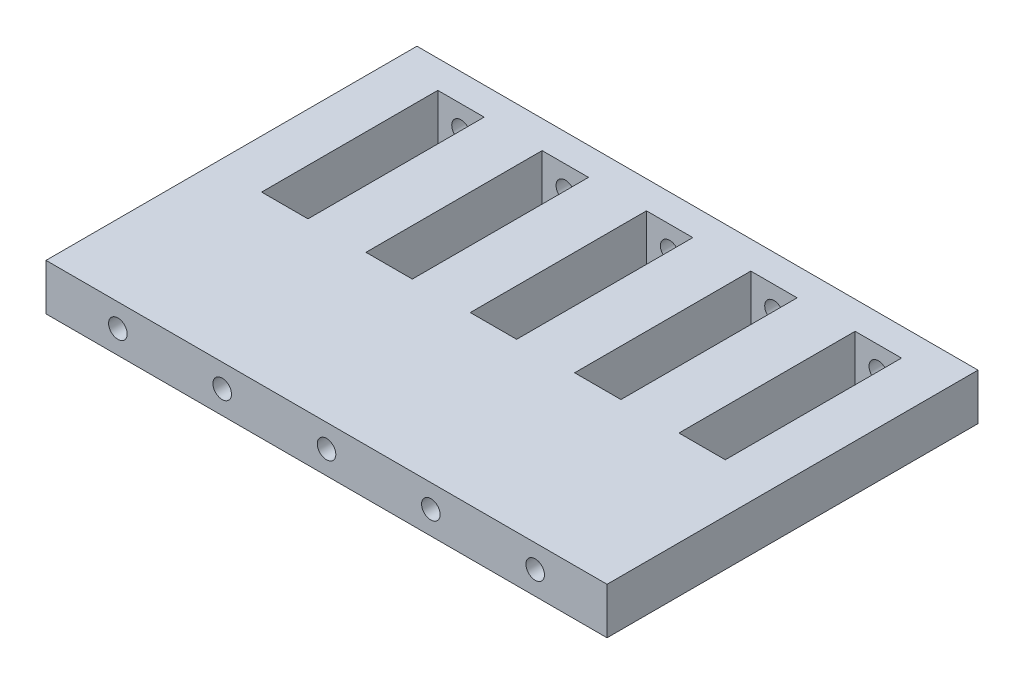
ISO-10303-21;
HEADER;
FILE_DESCRIPTION(('STEP AP214'),'2;1');
FILE_NAME('part.step','',(''),(''),'','','');
FILE_SCHEMA(('AUTOMOTIVE_DESIGN { 1 0 10303 214 1 1 1 1 }'));
ENDSEC;
DATA;
#1=APPLICATION_CONTEXT('core data for automotive mechanical design processes');
#2=APPLICATION_PROTOCOL_DEFINITION('international standard','automotive_design',2000,#1);
#3=PRODUCT_CONTEXT('',#1,'mechanical');
#4=PRODUCT('Part','Part','',(#3));
#5=PRODUCT_RELATED_PRODUCT_CATEGORY('part','',(#4));
#6=PRODUCT_DEFINITION_FORMATION('','',#4);
#7=PRODUCT_DEFINITION_CONTEXT('part definition',#1,'design');
#8=PRODUCT_DEFINITION('design','',#6,#7);
#9=PRODUCT_DEFINITION_SHAPE('','',#8);
#10=(LENGTH_UNIT() NAMED_UNIT(*) SI_UNIT(.MILLI.,.METRE.));
#11=(NAMED_UNIT(*) PLANE_ANGLE_UNIT() SI_UNIT($,.RADIAN.));
#12=(NAMED_UNIT(*) SI_UNIT($,.STERADIAN.) SOLID_ANGLE_UNIT());
#13=UNCERTAINTY_MEASURE_WITH_UNIT(LENGTH_MEASURE(1.E-05),#10,'distance_accuracy_value','');
#14=(GEOMETRIC_REPRESENTATION_CONTEXT(3) GLOBAL_UNCERTAINTY_ASSIGNED_CONTEXT((#13)) GLOBAL_UNIT_ASSIGNED_CONTEXT((#10,
#11,#12)) REPRESENTATION_CONTEXT('',''));
#15=CARTESIAN_POINT('',(0.,0.,0.));
#16=DIRECTION('',(0.,0.,1.));
#17=DIRECTION('',(1.,0.,0.));
#18=AXIS2_PLACEMENT_3D('',#15,#16,#17);
#19=CARTESIAN_POINT('',(-50.5,10.,0.));
#20=DIRECTION('',(1.,0.,0.));
#21=DIRECTION('',(0.,0.,-1.));
#22=AXIS2_PLACEMENT_3D('',#19,#20,#21);
#23=PLANE('',#22);
#24=DIRECTION('',(0.,0.,1.));
#25=VECTOR('',#24,1.);
#26=CARTESIAN_POINT('',(-50.5,0.,0.));
#27=LINE('',#26,#25);
#28=CARTESIAN_POINT('',(-50.5,0.,-80.));
#29=VERTEX_POINT('',#28);
#30=CARTESIAN_POINT('',(-50.5,0.,0.));
#31=VERTEX_POINT('',#30);
#32=EDGE_CURVE('E343',#29,#31,#27,.T.);
#33=ORIENTED_EDGE('',*,*,#32,.T.);
#34=DIRECTION('',(0.,-1.,0.));
#35=VECTOR('',#34,1.);
#36=CARTESIAN_POINT('',(-50.5,10.,0.));
#37=LINE('',#36,#35);
#38=CARTESIAN_POINT('',(-50.5,10.,0.));
#39=VERTEX_POINT('',#38);
#40=EDGE_CURVE('E11',#39,#31,#37,.T.);
#41=ORIENTED_EDGE('',*,*,#40,.F.);
#42=DIRECTION('',(0.,0.,1.));
#43=VECTOR('',#42,1.);
#44=CARTESIAN_POINT('',(-50.5,10.,0.));
#45=LINE('',#44,#43);
#46=CARTESIAN_POINT('',(-50.5,10.,-80.));
#47=VERTEX_POINT('',#46);
#48=EDGE_CURVE('E412',#47,#39,#45,.T.);
#49=ORIENTED_EDGE('',*,*,#48,.F.);
#50=DIRECTION('',(0.,-1.,0.));
#51=VECTOR('',#50,1.);
#52=CARTESIAN_POINT('',(-50.5,10.,-80.));
#53=LINE('',#52,#51);
#54=EDGE_CURVE('E422',#47,#29,#53,.T.);
#55=ORIENTED_EDGE('',*,*,#54,.T.);
#56=EDGE_LOOP('',(#33,#41,#49,#55));
#57=FACE_BOUND('',#56,.T.);
#58=ADVANCED_FACE('F37',(#57),#23,.F.);
#59=CARTESIAN_POINT('',(-50.5,10.,0.));
#60=DIRECTION('',(0.,0.,-1.));
#61=DIRECTION('',(-1.,0.,0.));
#62=AXIS2_PLACEMENT_3D('',#59,#60,#61);
#63=PLANE('',#62);
#64=CARTESIAN_POINT('',(-35.,5.,0.));
#65=DIRECTION('',(0.,0.,1.));
#66=DIRECTION('',(1.,0.,0.));
#67=AXIS2_PLACEMENT_3D('',#64,#65,#66);
#68=CIRCLE('',#67,2.);
#69=CARTESIAN_POINT('',(-33.,5.,0.));
#70=VERTEX_POINT('',#69);
#71=EDGE_CURVE('E279',#70,#70,#68,.T.);
#72=ORIENTED_EDGE('',*,*,#71,.F.);
#73=EDGE_LOOP('',(#72));
#74=FACE_BOUND('',#73,.T.);
#75=CARTESIAN_POINT('',(-12.5,5.,0.));
#76=DIRECTION('',(0.,0.,1.));
#77=DIRECTION('',(1.,0.,0.));
#78=AXIS2_PLACEMENT_3D('',#75,#76,#77);
#79=CIRCLE('',#78,2.);
#80=CARTESIAN_POINT('',(-10.5,5.,0.));
#81=VERTEX_POINT('',#80);
#82=EDGE_CURVE('E282',#81,#81,#79,.T.);
#83=ORIENTED_EDGE('',*,*,#82,.F.);
#84=EDGE_LOOP('',(#83));
#85=FACE_BOUND('',#84,.T.);
#86=CARTESIAN_POINT('',(9.99999999999999,5.,0.));
#87=DIRECTION('',(0.,0.,1.));
#88=DIRECTION('',(1.,0.,0.));
#89=AXIS2_PLACEMENT_3D('',#86,#87,#88);
#90=CIRCLE('',#89,2.);
#91=CARTESIAN_POINT('',(12.,5.,0.));
#92=VERTEX_POINT('',#91);
#93=EDGE_CURVE('E288',#92,#92,#90,.T.);
#94=ORIENTED_EDGE('',*,*,#93,.F.);
#95=EDGE_LOOP('',(#94));
#96=FACE_BOUND('',#95,.T.);
#97=CARTESIAN_POINT('',(32.5,5.,0.));
#98=DIRECTION('',(0.,0.,1.));
#99=DIRECTION('',(1.,0.,0.));
#100=AXIS2_PLACEMENT_3D('',#97,#98,#99);
#101=CIRCLE('',#100,2.);
#102=CARTESIAN_POINT('',(34.5,5.,0.));
#103=VERTEX_POINT('',#102);
#104=EDGE_CURVE('E294',#103,#103,#101,.T.);
#105=ORIENTED_EDGE('',*,*,#104,.F.);
#106=EDGE_LOOP('',(#105));
#107=FACE_BOUND('',#106,.T.);
#108=CARTESIAN_POINT('',(55.,5.,0.));
#109=DIRECTION('',(0.,0.,1.));
#110=DIRECTION('',(1.,0.,0.));
#111=AXIS2_PLACEMENT_3D('',#108,#109,#110);
#112=CIRCLE('',#111,2.);
#113=CARTESIAN_POINT('',(57.,5.,0.));
#114=VERTEX_POINT('',#113);
#115=EDGE_CURVE('E300',#114,#114,#112,.T.);
#116=ORIENTED_EDGE('',*,*,#115,.F.);
#117=EDGE_LOOP('',(#116));
#118=FACE_BOUND('',#117,.T.);
#119=DIRECTION('',(1.,0.,0.));
#120=VECTOR('',#119,1.);
#121=CARTESIAN_POINT('',(-50.5,0.,0.));
#122=LINE('',#121,#120);
#123=CARTESIAN_POINT('',(70.5,0.,0.));
#124=VERTEX_POINT('',#123);
#125=EDGE_CURVE('E425',#31,#124,#122,.T.);
#126=ORIENTED_EDGE('',*,*,#125,.T.);
#127=DIRECTION('',(0.,-1.,0.));
#128=VECTOR('',#127,1.);
#129=CARTESIAN_POINT('',(70.5,10.,0.));
#130=LINE('',#129,#128);
#131=CARTESIAN_POINT('',(70.5,10.,0.));
#132=VERTEX_POINT('',#131);
#133=EDGE_CURVE('E45',#132,#124,#130,.T.);
#134=ORIENTED_EDGE('',*,*,#133,.F.);
#135=DIRECTION('',(1.,0.,0.));
#136=VECTOR('',#135,1.);
#137=CARTESIAN_POINT('',(-50.5,10.,0.));
#138=LINE('',#137,#136);
#139=EDGE_CURVE('E415',#39,#132,#138,.T.);
#140=ORIENTED_EDGE('',*,*,#139,.F.);
#141=ORIENTED_EDGE('',*,*,#40,.T.);
#142=EDGE_LOOP('',(#126,#134,#140,#141));
#143=FACE_BOUND('',#142,.T.);
#144=ADVANCED_FACE('F466',(#74,#85,#96,#107,#118,#143),#63,.F.);
#145=CARTESIAN_POINT('',(70.5,10.,0.));
#146=DIRECTION('',(-1.,0.,0.));
#147=DIRECTION('',(0.,0.,1.));
#148=AXIS2_PLACEMENT_3D('',#145,#146,#147);
#149=PLANE('',#148);
#150=DIRECTION('',(0.,0.,-1.));
#151=VECTOR('',#150,1.);
#152=CARTESIAN_POINT('',(70.5,0.,0.));
#153=LINE('',#152,#151);
#154=CARTESIAN_POINT('',(70.5,0.,-80.));
#155=VERTEX_POINT('',#154);
#156=EDGE_CURVE('E427',#124,#155,#153,.T.);
#157=ORIENTED_EDGE('',*,*,#156,.T.);
#158=DIRECTION('',(0.,-1.,0.));
#159=VECTOR('',#158,1.);
#160=CARTESIAN_POINT('',(70.5,10.,-80.));
#161=LINE('',#160,#159);
#162=CARTESIAN_POINT('',(70.5,10.,-80.));
#163=VERTEX_POINT('',#162);
#164=EDGE_CURVE('E432',#163,#155,#161,.T.);
#165=ORIENTED_EDGE('',*,*,#164,.F.);
#166=DIRECTION('',(0.,0.,-1.));
#167=VECTOR('',#166,1.);
#168=CARTESIAN_POINT('',(70.5,10.,0.));
#169=LINE('',#168,#167);
#170=EDGE_CURVE('E418',#132,#163,#169,.T.);
#171=ORIENTED_EDGE('',*,*,#170,.F.);
#172=ORIENTED_EDGE('',*,*,#133,.T.);
#173=EDGE_LOOP('',(#157,#165,#171,#172));
#174=FACE_BOUND('',#173,.T.);
#175=ADVANCED_FACE('F471',(#174),#149,.F.);
#176=CARTESIAN_POINT('',(-50.5,10.,-80.));
#177=DIRECTION('',(0.,0.,1.));
#178=DIRECTION('',(1.,0.,0.));
#179=AXIS2_PLACEMENT_3D('',#176,#177,#178);
#180=PLANE('',#179);
#181=CARTESIAN_POINT('',(-35.,5.,-80.));
#182=DIRECTION('',(0.,0.,1.));
#183=DIRECTION('',(1.,0.,0.));
#184=AXIS2_PLACEMENT_3D('',#181,#182,#183);
#185=CIRCLE('',#184,2.);
#186=CARTESIAN_POINT('',(-33.,5.,-80.));
#187=VERTEX_POINT('',#186);
#188=EDGE_CURVE('E275',#187,#187,#185,.T.);
#189=ORIENTED_EDGE('',*,*,#188,.T.);
#190=EDGE_LOOP('',(#189));
#191=FACE_BOUND('',#190,.T.);
#192=CARTESIAN_POINT('',(-12.5,5.,-80.));
#193=DIRECTION('',(0.,0.,1.));
#194=DIRECTION('',(1.,0.,0.));
#195=AXIS2_PLACEMENT_3D('',#192,#193,#194);
#196=CIRCLE('',#195,2.);
#197=CARTESIAN_POINT('',(-10.5,5.,-80.));
#198=VERTEX_POINT('',#197);
#199=EDGE_CURVE('E285',#198,#198,#196,.T.);
#200=ORIENTED_EDGE('',*,*,#199,.T.);
#201=EDGE_LOOP('',(#200));
#202=FACE_BOUND('',#201,.T.);
#203=CARTESIAN_POINT('',(9.99999999999999,5.,-80.));
#204=DIRECTION('',(0.,0.,1.));
#205=DIRECTION('',(1.,0.,0.));
#206=AXIS2_PLACEMENT_3D('',#203,#204,#205);
#207=CIRCLE('',#206,2.);
#208=CARTESIAN_POINT('',(12.,5.,-80.));
#209=VERTEX_POINT('',#208);
#210=EDGE_CURVE('E291',#209,#209,#207,.T.);
#211=ORIENTED_EDGE('',*,*,#210,.T.);
#212=EDGE_LOOP('',(#211));
#213=FACE_BOUND('',#212,.T.);
#214=CARTESIAN_POINT('',(32.5,5.,-80.));
#215=DIRECTION('',(0.,0.,1.));
#216=DIRECTION('',(1.,0.,0.));
#217=AXIS2_PLACEMENT_3D('',#214,#215,#216);
#218=CIRCLE('',#217,2.);
#219=CARTESIAN_POINT('',(34.5,5.,-80.));
#220=VERTEX_POINT('',#219);
#221=EDGE_CURVE('E297',#220,#220,#218,.T.);
#222=ORIENTED_EDGE('',*,*,#221,.T.);
#223=EDGE_LOOP('',(#222));
#224=FACE_BOUND('',#223,.T.);
#225=CARTESIAN_POINT('',(55.,5.,-80.));
#226=DIRECTION('',(0.,0.,1.));
#227=DIRECTION('',(1.,0.,0.));
#228=AXIS2_PLACEMENT_3D('',#225,#226,#227);
#229=CIRCLE('',#228,2.);
#230=CARTESIAN_POINT('',(57.,5.,-80.));
#231=VERTEX_POINT('',#230);
#232=EDGE_CURVE('E274',#231,#231,#229,.T.);
#233=ORIENTED_EDGE('',*,*,#232,.T.);
#234=EDGE_LOOP('',(#233));
#235=FACE_BOUND('',#234,.T.);
#236=DIRECTION('',(-1.,0.,0.));
#237=VECTOR('',#236,1.);
#238=CARTESIAN_POINT('',(-50.5,0.,-80.));
#239=LINE('',#238,#237);
#240=EDGE_CURVE('E416',#155,#29,#239,.T.);
#241=ORIENTED_EDGE('',*,*,#240,.T.);
#242=ORIENTED_EDGE('',*,*,#54,.F.);
#243=DIRECTION('',(-1.,0.,0.));
#244=VECTOR('',#243,1.);
#245=CARTESIAN_POINT('',(-50.5,10.,-80.));
#246=LINE('',#245,#244);
#247=EDGE_CURVE('E420',#163,#47,#246,.T.);
#248=ORIENTED_EDGE('',*,*,#247,.F.);
#249=ORIENTED_EDGE('',*,*,#164,.T.);
#250=EDGE_LOOP('',(#241,#242,#248,#249));
#251=FACE_BOUND('',#250,.T.);
#252=ADVANCED_FACE('F488',(#191,#202,#213,#224,#235,#251),#180,.F.);
#253=CARTESIAN_POINT('',(0.,10.,0.));
#254=DIRECTION('',(0.,-1.,0.));
#255=DIRECTION('',(0.,0.,-1.));
#256=AXIS2_PLACEMENT_3D('',#253,#254,#255);
#257=PLANE('',#256);
#258=DIRECTION('',(-1.,0.,0.));
#259=VECTOR('',#258,1.);
#260=CARTESIAN_POINT('',(-40.,10.,-36.));
#261=LINE('',#260,#259);
#262=CARTESIAN_POINT('',(-7.49999999999999,10.,-36.));
#263=VERTEX_POINT('',#262);
#264=CARTESIAN_POINT('',(-17.5,10.,-36.));
#265=VERTEX_POINT('',#264);
#266=EDGE_CURVE('E233',#263,#265,#261,.T.);
#267=ORIENTED_EDGE('',*,*,#266,.T.);
#268=DIRECTION('',(0.,0.,1.));
#269=VECTOR('',#268,1.);
#270=CARTESIAN_POINT('',(-17.5,10.,-74.));
#271=LINE('',#270,#269);
#272=CARTESIAN_POINT('',(-17.5,10.,-74.));
#273=VERTEX_POINT('',#272);
#274=EDGE_CURVE('E352',#273,#265,#271,.T.);
#275=ORIENTED_EDGE('',*,*,#274,.F.);
#276=DIRECTION('',(-1.,0.,0.));
#277=VECTOR('',#276,1.);
#278=CARTESIAN_POINT('',(-17.5,10.,-74.));
#279=LINE('',#278,#277);
#280=CARTESIAN_POINT('',(-7.5,10.,-74.));
#281=VERTEX_POINT('',#280);
#282=EDGE_CURVE('E354',#281,#273,#279,.T.);
#283=ORIENTED_EDGE('',*,*,#282,.F.);
#284=DIRECTION('',(0.,0.,-1.));
#285=VECTOR('',#284,1.);
#286=CARTESIAN_POINT('',(-7.5,10.,-74.));
#287=LINE('',#286,#285);
#288=EDGE_CURVE('E337',#263,#281,#287,.T.);
#289=ORIENTED_EDGE('',*,*,#288,.F.);
#290=EDGE_LOOP('',(#267,#275,#283,#289));
#291=FACE_BOUND('',#290,.T.);
#292=CARTESIAN_POINT('',(15.,10.,-36.));
#293=VERTEX_POINT('',#292);
#294=CARTESIAN_POINT('',(5.,10.,-36.));
#295=VERTEX_POINT('',#294);
#296=EDGE_CURVE('E230',#293,#295,#261,.T.);
#297=ORIENTED_EDGE('',*,*,#296,.T.);
#298=DIRECTION('',(0.,0.,1.));
#299=VECTOR('',#298,1.);
#300=CARTESIAN_POINT('',(4.99999999999999,10.,-74.));
#301=LINE('',#300,#299);
#302=CARTESIAN_POINT('',(4.99999999999999,10.,-74.));
#303=VERTEX_POINT('',#302);
#304=EDGE_CURVE('E248',#303,#295,#301,.T.);
#305=ORIENTED_EDGE('',*,*,#304,.F.);
#306=DIRECTION('',(-1.,0.,0.));
#307=VECTOR('',#306,1.);
#308=CARTESIAN_POINT('',(4.99999999999999,10.,-74.));
#309=LINE('',#308,#307);
#310=CARTESIAN_POINT('',(15.,10.,-74.));
#311=VERTEX_POINT('',#310);
#312=EDGE_CURVE('E373',#311,#303,#309,.T.);
#313=ORIENTED_EDGE('',*,*,#312,.F.);
#314=DIRECTION('',(0.,0.,-1.));
#315=VECTOR('',#314,1.);
#316=CARTESIAN_POINT('',(15.,10.,-74.));
#317=LINE('',#316,#315);
#318=EDGE_CURVE('E249',#293,#311,#317,.T.);
#319=ORIENTED_EDGE('',*,*,#318,.F.);
#320=EDGE_LOOP('',(#297,#305,#313,#319));
#321=FACE_BOUND('',#320,.T.);
#322=CARTESIAN_POINT('',(37.5,10.,-36.));
#323=VERTEX_POINT('',#322);
#324=CARTESIAN_POINT('',(27.5,10.,-36.));
#325=VERTEX_POINT('',#324);
#326=EDGE_CURVE('E223',#323,#325,#261,.T.);
#327=ORIENTED_EDGE('',*,*,#326,.T.);
#328=DIRECTION('',(0.,0.,1.));
#329=VECTOR('',#328,1.);
#330=CARTESIAN_POINT('',(27.5,10.,-74.));
#331=LINE('',#330,#329);
#332=CARTESIAN_POINT('',(27.5,10.,-74.));
#333=VERTEX_POINT('',#332);
#334=EDGE_CURVE('E388',#333,#325,#331,.T.);
#335=ORIENTED_EDGE('',*,*,#334,.F.);
#336=DIRECTION('',(-1.,0.,0.));
#337=VECTOR('',#336,1.);
#338=CARTESIAN_POINT('',(27.5,10.,-74.));
#339=LINE('',#338,#337);
#340=CARTESIAN_POINT('',(37.5,10.,-74.));
#341=VERTEX_POINT('',#340);
#342=EDGE_CURVE('E390',#341,#333,#339,.T.);
#343=ORIENTED_EDGE('',*,*,#342,.F.);
#344=DIRECTION('',(0.,0.,-1.));
#345=VECTOR('',#344,1.);
#346=CARTESIAN_POINT('',(37.5,10.,-74.));
#347=LINE('',#346,#345);
#348=EDGE_CURVE('E371',#323,#341,#347,.T.);
#349=ORIENTED_EDGE('',*,*,#348,.F.);
#350=EDGE_LOOP('',(#327,#335,#343,#349));
#351=FACE_BOUND('',#350,.T.);
#352=CARTESIAN_POINT('',(60.,10.,-36.));
#353=VERTEX_POINT('',#352);
#354=CARTESIAN_POINT('',(50.,10.,-36.));
#355=VERTEX_POINT('',#354);
#356=EDGE_CURVE('E203',#353,#355,#261,.T.);
#357=ORIENTED_EDGE('',*,*,#356,.T.);
#358=DIRECTION('',(0.,0.,1.));
#359=VECTOR('',#358,1.);
#360=CARTESIAN_POINT('',(50.,10.,-74.));
#361=LINE('',#360,#359);
#362=CARTESIAN_POINT('',(50.,10.,-74.));
#363=VERTEX_POINT('',#362);
#364=EDGE_CURVE('E58',#363,#355,#361,.T.);
#365=ORIENTED_EDGE('',*,*,#364,.F.);
#366=DIRECTION('',(-1.,0.,0.));
#367=VECTOR('',#366,1.);
#368=CARTESIAN_POINT('',(50.,10.,-74.));
#369=LINE('',#368,#367);
#370=CARTESIAN_POINT('',(60.,10.,-74.));
#371=VERTEX_POINT('',#370);
#372=EDGE_CURVE('E205',#371,#363,#369,.T.);
#373=ORIENTED_EDGE('',*,*,#372,.F.);
#374=DIRECTION('',(0.,0.,-1.));
#375=VECTOR('',#374,1.);
#376=CARTESIAN_POINT('',(60.,10.,-74.));
#377=LINE('',#376,#375);
#378=EDGE_CURVE('E198',#353,#371,#377,.T.);
#379=ORIENTED_EDGE('',*,*,#378,.F.);
#380=EDGE_LOOP('',(#357,#365,#373,#379));
#381=FACE_BOUND('',#380,.T.);
#382=DIRECTION('',(0.,0.,-1.));
#383=VECTOR('',#382,1.);
#384=CARTESIAN_POINT('',(-30.,10.,-74.));
#385=LINE('',#384,#383);
#386=CARTESIAN_POINT('',(-30.,10.,-36.));
#387=VERTEX_POINT('',#386);
#388=CARTESIAN_POINT('',(-30.,10.,-74.));
#389=VERTEX_POINT('',#388);
#390=EDGE_CURVE('E334',#387,#389,#385,.T.);
#391=ORIENTED_EDGE('',*,*,#390,.F.);
#392=CARTESIAN_POINT('',(-40.,10.,-36.));
#393=VERTEX_POINT('',#392);
#394=EDGE_CURVE('E225',#387,#393,#261,.T.);
#395=ORIENTED_EDGE('',*,*,#394,.T.);
#396=DIRECTION('',(0.,0.,1.));
#397=VECTOR('',#396,1.);
#398=CARTESIAN_POINT('',(-40.,10.,-74.));
#399=LINE('',#398,#397);
#400=CARTESIAN_POINT('',(-40.,10.,-74.));
#401=VERTEX_POINT('',#400);
#402=EDGE_CURVE('E327',#401,#393,#399,.T.);
#403=ORIENTED_EDGE('',*,*,#402,.F.);
#404=DIRECTION('',(-1.,0.,0.));
#405=VECTOR('',#404,1.);
#406=CARTESIAN_POINT('',(-40.,10.,-74.));
#407=LINE('',#406,#405);
#408=EDGE_CURVE('E336',#389,#401,#407,.T.);
#409=ORIENTED_EDGE('',*,*,#408,.F.);
#410=EDGE_LOOP('',(#391,#395,#403,#409));
#411=FACE_BOUND('',#410,.T.);
#412=ORIENTED_EDGE('',*,*,#48,.T.);
#413=ORIENTED_EDGE('',*,*,#139,.T.);
#414=ORIENTED_EDGE('',*,*,#170,.T.);
#415=ORIENTED_EDGE('',*,*,#247,.T.);
#416=EDGE_LOOP('',(#412,#413,#414,#415));
#417=FACE_BOUND('',#416,.T.);
#418=ADVANCED_FACE('F200',(#291,#321,#351,#381,#411,#417),#257,.F.);
#419=CARTESIAN_POINT('',(0.,0.,0.));
#420=DIRECTION('',(0.,-1.,0.));
#421=DIRECTION('',(0.,0.,-1.));
#422=AXIS2_PLACEMENT_3D('',#419,#420,#421);
#423=PLANE('',#422);
#424=DIRECTION('',(0.,0.,1.));
#425=VECTOR('',#424,1.);
#426=CARTESIAN_POINT('',(-17.5,0.,-74.));
#427=LINE('',#426,#425);
#428=CARTESIAN_POINT('',(-17.5,0.,-74.));
#429=VERTEX_POINT('',#428);
#430=CARTESIAN_POINT('',(-17.5,0.,-36.));
#431=VERTEX_POINT('',#430);
#432=EDGE_CURVE('E349',#429,#431,#427,.T.);
#433=ORIENTED_EDGE('',*,*,#432,.T.);
#434=DIRECTION('',(-1.,0.,0.));
#435=VECTOR('',#434,1.);
#436=CARTESIAN_POINT('',(-40.,0.,-36.));
#437=LINE('',#436,#435);
#438=CARTESIAN_POINT('',(-7.49999999999999,0.,-36.));
#439=VERTEX_POINT('',#438);
#440=EDGE_CURVE('E227',#439,#431,#437,.T.);
#441=ORIENTED_EDGE('',*,*,#440,.F.);
#442=DIRECTION('',(0.,0.,-1.));
#443=VECTOR('',#442,1.);
#444=CARTESIAN_POINT('',(-7.5,0.,-74.));
#445=LINE('',#444,#443);
#446=CARTESIAN_POINT('',(-7.5,0.,-74.));
#447=VERTEX_POINT('',#446);
#448=EDGE_CURVE('E355',#439,#447,#445,.T.);
#449=ORIENTED_EDGE('',*,*,#448,.T.);
#450=DIRECTION('',(-1.,0.,0.));
#451=VECTOR('',#450,1.);
#452=CARTESIAN_POINT('',(-17.5,0.,-74.));
#453=LINE('',#452,#451);
#454=EDGE_CURVE('E361',#447,#429,#453,.T.);
#455=ORIENTED_EDGE('',*,*,#454,.T.);
#456=EDGE_LOOP('',(#433,#441,#449,#455));
#457=FACE_BOUND('',#456,.T.);
#458=DIRECTION('',(0.,0.,1.));
#459=VECTOR('',#458,1.);
#460=CARTESIAN_POINT('',(4.99999999999999,0.,-74.));
#461=LINE('',#460,#459);
#462=CARTESIAN_POINT('',(4.99999999999999,0.,-74.));
#463=VERTEX_POINT('',#462);
#464=CARTESIAN_POINT('',(5.,0.,-36.));
#465=VERTEX_POINT('',#464);
#466=EDGE_CURVE('E368',#463,#465,#461,.T.);
#467=ORIENTED_EDGE('',*,*,#466,.T.);
#468=CARTESIAN_POINT('',(15.,0.,-36.));
#469=VERTEX_POINT('',#468);
#470=EDGE_CURVE('E259',#469,#465,#437,.T.);
#471=ORIENTED_EDGE('',*,*,#470,.F.);
#472=DIRECTION('',(0.,0.,-1.));
#473=VECTOR('',#472,1.);
#474=CARTESIAN_POINT('',(15.,0.,-74.));
#475=LINE('',#474,#473);
#476=CARTESIAN_POINT('',(15.,0.,-74.));
#477=VERTEX_POINT('',#476);
#478=EDGE_CURVE('E374',#469,#477,#475,.T.);
#479=ORIENTED_EDGE('',*,*,#478,.T.);
#480=DIRECTION('',(-1.,0.,0.));
#481=VECTOR('',#480,1.);
#482=CARTESIAN_POINT('',(4.99999999999999,0.,-74.));
#483=LINE('',#482,#481);
#484=EDGE_CURVE('E379',#477,#463,#483,.T.);
#485=ORIENTED_EDGE('',*,*,#484,.T.);
#486=EDGE_LOOP('',(#467,#471,#479,#485));
#487=FACE_BOUND('',#486,.T.);
#488=DIRECTION('',(0.,0.,1.));
#489=VECTOR('',#488,1.);
#490=CARTESIAN_POINT('',(27.5,0.,-74.));
#491=LINE('',#490,#489);
#492=CARTESIAN_POINT('',(27.5,0.,-74.));
#493=VERTEX_POINT('',#492);
#494=CARTESIAN_POINT('',(27.5,0.,-36.));
#495=VERTEX_POINT('',#494);
#496=EDGE_CURVE('E386',#493,#495,#491,.T.);
#497=ORIENTED_EDGE('',*,*,#496,.T.);
#498=CARTESIAN_POINT('',(37.5,0.,-36.));
#499=VERTEX_POINT('',#498);
#500=EDGE_CURVE('E584',#499,#495,#437,.T.);
#501=ORIENTED_EDGE('',*,*,#500,.F.);
#502=DIRECTION('',(0.,0.,-1.));
#503=VECTOR('',#502,1.);
#504=CARTESIAN_POINT('',(37.5,0.,-74.));
#505=LINE('',#504,#503);
#506=CARTESIAN_POINT('',(37.5,0.,-74.));
#507=VERTEX_POINT('',#506);
#508=EDGE_CURVE('E391',#499,#507,#505,.T.);
#509=ORIENTED_EDGE('',*,*,#508,.T.);
#510=DIRECTION('',(-1.,0.,0.));
#511=VECTOR('',#510,1.);
#512=CARTESIAN_POINT('',(27.5,0.,-74.));
#513=LINE('',#512,#511);
#514=EDGE_CURVE('E397',#507,#493,#513,.T.);
#515=ORIENTED_EDGE('',*,*,#514,.T.);
#516=EDGE_LOOP('',(#497,#501,#509,#515));
#517=FACE_BOUND('',#516,.T.);
#518=DIRECTION('',(0.,0.,1.));
#519=VECTOR('',#518,1.);
#520=CARTESIAN_POINT('',(50.,0.,-74.));
#521=LINE('',#520,#519);
#522=CARTESIAN_POINT('',(50.,0.,-74.));
#523=VERTEX_POINT('',#522);
#524=CARTESIAN_POINT('',(50.,0.,-36.));
#525=VERTEX_POINT('',#524);
#526=EDGE_CURVE('E403',#523,#525,#521,.T.);
#527=ORIENTED_EDGE('',*,*,#526,.T.);
#528=CARTESIAN_POINT('',(60.,0.,-36.));
#529=VERTEX_POINT('',#528);
#530=EDGE_CURVE('E219',#529,#525,#437,.T.);
#531=ORIENTED_EDGE('',*,*,#530,.F.);
#532=DIRECTION('',(0.,0.,-1.));
#533=VECTOR('',#532,1.);
#534=CARTESIAN_POINT('',(60.,0.,-74.));
#535=LINE('',#534,#533);
#536=CARTESIAN_POINT('',(60.,0.,-74.));
#537=VERTEX_POINT('',#536);
#538=EDGE_CURVE('E214',#529,#537,#535,.T.);
#539=ORIENTED_EDGE('',*,*,#538,.T.);
#540=DIRECTION('',(-1.,0.,0.));
#541=VECTOR('',#540,1.);
#542=CARTESIAN_POINT('',(50.,0.,-74.));
#543=LINE('',#542,#541);
#544=EDGE_CURVE('E408',#537,#523,#543,.T.);
#545=ORIENTED_EDGE('',*,*,#544,.T.);
#546=EDGE_LOOP('',(#527,#531,#539,#545));
#547=FACE_BOUND('',#546,.T.);
#548=CARTESIAN_POINT('',(-30.,0.,-36.));
#549=VERTEX_POINT('',#548);
#550=CARTESIAN_POINT('',(-40.,0.,-36.));
#551=VERTEX_POINT('',#550);
#552=EDGE_CURVE('E222',#549,#551,#437,.T.);
#553=ORIENTED_EDGE('',*,*,#552,.F.);
#554=DIRECTION('',(0.,0.,-1.));
#555=VECTOR('',#554,1.);
#556=CARTESIAN_POINT('',(-30.,0.,-74.));
#557=LINE('',#556,#555);
#558=CARTESIAN_POINT('',(-30.,0.,-74.));
#559=VERTEX_POINT('',#558);
#560=EDGE_CURVE('E324',#549,#559,#557,.T.);
#561=ORIENTED_EDGE('',*,*,#560,.T.);
#562=DIRECTION('',(-1.,0.,0.));
#563=VECTOR('',#562,1.);
#564=CARTESIAN_POINT('',(-40.,0.,-74.));
#565=LINE('',#564,#563);
#566=CARTESIAN_POINT('',(-40.,0.,-74.));
#567=VERTEX_POINT('',#566);
#568=EDGE_CURVE('E326',#559,#567,#565,.T.);
#569=ORIENTED_EDGE('',*,*,#568,.T.);
#570=DIRECTION('',(0.,0.,1.));
#571=VECTOR('',#570,1.);
#572=CARTESIAN_POINT('',(-40.,0.,-74.));
#573=LINE('',#572,#571);
#574=EDGE_CURVE('E330',#567,#551,#573,.T.);
#575=ORIENTED_EDGE('',*,*,#574,.T.);
#576=EDGE_LOOP('',(#553,#561,#569,#575));
#577=FACE_BOUND('',#576,.T.);
#578=ORIENTED_EDGE('',*,*,#32,.F.);
#579=ORIENTED_EDGE('',*,*,#240,.F.);
#580=ORIENTED_EDGE('',*,*,#156,.F.);
#581=ORIENTED_EDGE('',*,*,#125,.F.);
#582=EDGE_LOOP('',(#578,#579,#580,#581));
#583=FACE_BOUND('',#582,.T.);
#584=ADVANCED_FACE('F479',(#457,#487,#517,#547,#577,#583),#423,.T.);
#585=CARTESIAN_POINT('',(50.,0.,-74.));
#586=DIRECTION('',(-1.,0.,0.));
#587=DIRECTION('',(0.,0.,1.));
#588=AXIS2_PLACEMENT_3D('',#585,#586,#587);
#589=PLANE('',#588);
#590=ORIENTED_EDGE('',*,*,#364,.T.);
#591=DIRECTION('',(0.,-1.,0.));
#592=VECTOR('',#591,1.);
#593=CARTESIAN_POINT('',(50.,0.,-36.));
#594=LINE('',#593,#592);
#595=EDGE_CURVE('E53',#355,#525,#594,.T.);
#596=ORIENTED_EDGE('',*,*,#595,.T.);
#597=ORIENTED_EDGE('',*,*,#526,.F.);
#598=DIRECTION('',(0.,1.,0.));
#599=VECTOR('',#598,1.);
#600=CARTESIAN_POINT('',(50.,0.,-74.));
#601=LINE('',#600,#599);
#602=EDGE_CURVE('E323',#523,#363,#601,.T.);
#603=ORIENTED_EDGE('',*,*,#602,.T.);
#604=EDGE_LOOP('',(#590,#596,#597,#603));
#605=FACE_BOUND('',#604,.T.);
#606=ADVANCED_FACE('F500',(#605),#589,.F.);
#607=CARTESIAN_POINT('',(50.,0.,-74.));
#608=DIRECTION('',(0.,0.,-1.));
#609=DIRECTION('',(-1.,0.,0.));
#610=AXIS2_PLACEMENT_3D('',#607,#608,#609);
#611=PLANE('',#610);
#612=CARTESIAN_POINT('',(55.,5.,-74.));
#613=DIRECTION('',(0.,0.,-1.));
#614=DIRECTION('',(-1.,0.,0.));
#615=AXIS2_PLACEMENT_3D('',#612,#613,#614);
#616=CIRCLE('',#615,2.);
#617=CARTESIAN_POINT('',(53.,5.,-74.));
#618=VERTEX_POINT('',#617);
#619=EDGE_CURVE('E40',#618,#618,#616,.T.);
#620=ORIENTED_EDGE('',*,*,#619,.T.);
#621=EDGE_LOOP('',(#620));
#622=FACE_BOUND('',#621,.T.);
#623=ORIENTED_EDGE('',*,*,#372,.T.);
#624=ORIENTED_EDGE('',*,*,#602,.F.);
#625=ORIENTED_EDGE('',*,*,#544,.F.);
#626=DIRECTION('',(0.,1.,0.));
#627=VECTOR('',#626,1.);
#628=CARTESIAN_POINT('',(60.,0.,-74.));
#629=LINE('',#628,#627);
#630=EDGE_CURVE('E401',#537,#371,#629,.T.);
#631=ORIENTED_EDGE('',*,*,#630,.T.);
#632=EDGE_LOOP('',(#623,#624,#625,#631));
#633=FACE_BOUND('',#632,.T.);
#634=ADVANCED_FACE('F506',(#622,#633),#611,.F.);
#635=CARTESIAN_POINT('',(60.,0.,-74.));
#636=DIRECTION('',(1.,0.,0.));
#637=DIRECTION('',(0.,0.,-1.));
#638=AXIS2_PLACEMENT_3D('',#635,#636,#637);
#639=PLANE('',#638);
#640=ORIENTED_EDGE('',*,*,#538,.F.);
#641=DIRECTION('',(0.,1.,0.));
#642=VECTOR('',#641,1.);
#643=CARTESIAN_POINT('',(60.,0.,-36.));
#644=LINE('',#643,#642);
#645=EDGE_CURVE('E212',#529,#353,#644,.T.);
#646=ORIENTED_EDGE('',*,*,#645,.T.);
#647=ORIENTED_EDGE('',*,*,#378,.T.);
#648=ORIENTED_EDGE('',*,*,#630,.F.);
#649=EDGE_LOOP('',(#640,#646,#647,#648));
#650=FACE_BOUND('',#649,.T.);
#651=ADVANCED_FACE('F213',(#650),#639,.F.);
#652=CARTESIAN_POINT('',(27.5,0.,-74.));
#653=DIRECTION('',(-1.,0.,0.));
#654=DIRECTION('',(0.,0.,1.));
#655=AXIS2_PLACEMENT_3D('',#652,#653,#654);
#656=PLANE('',#655);
#657=ORIENTED_EDGE('',*,*,#334,.T.);
#658=DIRECTION('',(0.,-1.,0.));
#659=VECTOR('',#658,1.);
#660=CARTESIAN_POINT('',(27.5,0.,-36.));
#661=LINE('',#660,#659);
#662=EDGE_CURVE('E266',#325,#495,#661,.T.);
#663=ORIENTED_EDGE('',*,*,#662,.T.);
#664=ORIENTED_EDGE('',*,*,#496,.F.);
#665=DIRECTION('',(0.,1.,0.));
#666=VECTOR('',#665,1.);
#667=CARTESIAN_POINT('',(27.5,0.,-74.));
#668=LINE('',#667,#666);
#669=EDGE_CURVE('E209',#493,#333,#668,.T.);
#670=ORIENTED_EDGE('',*,*,#669,.T.);
#671=EDGE_LOOP('',(#657,#663,#664,#670));
#672=FACE_BOUND('',#671,.T.);
#673=ADVANCED_FACE('F512',(#672),#656,.F.);
#674=CARTESIAN_POINT('',(27.5,0.,-74.));
#675=DIRECTION('',(0.,0.,-1.));
#676=DIRECTION('',(-1.,0.,0.));
#677=AXIS2_PLACEMENT_3D('',#674,#675,#676);
#678=PLANE('',#677);
#679=CARTESIAN_POINT('',(32.5,5.,-74.));
#680=DIRECTION('',(0.,0.,-1.));
#681=DIRECTION('',(-1.,0.,0.));
#682=AXIS2_PLACEMENT_3D('',#679,#680,#681);
#683=CIRCLE('',#682,2.);
#684=CARTESIAN_POINT('',(30.5,5.,-74.));
#685=VERTEX_POINT('',#684);
#686=EDGE_CURVE('E316',#685,#685,#683,.T.);
#687=ORIENTED_EDGE('',*,*,#686,.T.);
#688=EDGE_LOOP('',(#687));
#689=FACE_BOUND('',#688,.T.);
#690=ORIENTED_EDGE('',*,*,#342,.T.);
#691=ORIENTED_EDGE('',*,*,#669,.F.);
#692=ORIENTED_EDGE('',*,*,#514,.F.);
#693=DIRECTION('',(0.,1.,0.));
#694=VECTOR('',#693,1.);
#695=CARTESIAN_POINT('',(37.5,0.,-74.));
#696=LINE('',#695,#694);
#697=EDGE_CURVE('E383',#507,#341,#696,.T.);
#698=ORIENTED_EDGE('',*,*,#697,.T.);
#699=EDGE_LOOP('',(#690,#691,#692,#698));
#700=FACE_BOUND('',#699,.T.);
#701=ADVANCED_FACE('F445',(#689,#700),#678,.F.);
#702=CARTESIAN_POINT('',(37.5,0.,-74.));
#703=DIRECTION('',(1.,0.,0.));
#704=DIRECTION('',(0.,0.,-1.));
#705=AXIS2_PLACEMENT_3D('',#702,#703,#704);
#706=PLANE('',#705);
#707=ORIENTED_EDGE('',*,*,#508,.F.);
#708=DIRECTION('',(0.,1.,0.));
#709=VECTOR('',#708,1.);
#710=CARTESIAN_POINT('',(37.5,0.,-36.));
#711=LINE('',#710,#709);
#712=EDGE_CURVE('E263',#499,#323,#711,.T.);
#713=ORIENTED_EDGE('',*,*,#712,.T.);
#714=ORIENTED_EDGE('',*,*,#348,.T.);
#715=ORIENTED_EDGE('',*,*,#697,.F.);
#716=EDGE_LOOP('',(#707,#713,#714,#715));
#717=FACE_BOUND('',#716,.T.);
#718=ADVANCED_FACE('F518',(#717),#706,.F.);
#719=CARTESIAN_POINT('',(4.99999999999999,0.,-74.));
#720=DIRECTION('',(-1.,0.,0.));
#721=DIRECTION('',(0.,0.,1.));
#722=AXIS2_PLACEMENT_3D('',#719,#720,#721);
#723=PLANE('',#722);
#724=ORIENTED_EDGE('',*,*,#304,.T.);
#725=DIRECTION('',(0.,-1.,0.));
#726=VECTOR('',#725,1.);
#727=CARTESIAN_POINT('',(5.,0.,-36.));
#728=LINE('',#727,#726);
#729=EDGE_CURVE('E258',#295,#465,#728,.T.);
#730=ORIENTED_EDGE('',*,*,#729,.T.);
#731=ORIENTED_EDGE('',*,*,#466,.F.);
#732=DIRECTION('',(0.,1.,0.));
#733=VECTOR('',#732,1.);
#734=CARTESIAN_POINT('',(4.99999999999999,0.,-74.));
#735=LINE('',#734,#733);
#736=EDGE_CURVE('E369',#463,#303,#735,.T.);
#737=ORIENTED_EDGE('',*,*,#736,.T.);
#738=EDGE_LOOP('',(#724,#730,#731,#737));
#739=FACE_BOUND('',#738,.T.);
#740=ADVANCED_FACE('F521',(#739),#723,.F.);
#741=CARTESIAN_POINT('',(4.99999999999999,0.,-74.));
#742=DIRECTION('',(0.,0.,-1.));
#743=DIRECTION('',(-1.,0.,0.));
#744=AXIS2_PLACEMENT_3D('',#741,#742,#743);
#745=PLANE('',#744);
#746=CARTESIAN_POINT('',(9.99999999999999,5.,-74.));
#747=DIRECTION('',(0.,0.,-1.));
#748=DIRECTION('',(-1.,0.,0.));
#749=AXIS2_PLACEMENT_3D('',#746,#747,#748);
#750=CIRCLE('',#749,2.);
#751=CARTESIAN_POINT('',(7.99999999999999,5.,-74.));
#752=VERTEX_POINT('',#751);
#753=EDGE_CURVE('E312',#752,#752,#750,.T.);
#754=ORIENTED_EDGE('',*,*,#753,.T.);
#755=EDGE_LOOP('',(#754));
#756=FACE_BOUND('',#755,.T.);
#757=ORIENTED_EDGE('',*,*,#312,.T.);
#758=ORIENTED_EDGE('',*,*,#736,.F.);
#759=ORIENTED_EDGE('',*,*,#484,.F.);
#760=DIRECTION('',(0.,1.,0.));
#761=VECTOR('',#760,1.);
#762=CARTESIAN_POINT('',(15.,0.,-74.));
#763=LINE('',#762,#761);
#764=EDGE_CURVE('E365',#477,#311,#763,.T.);
#765=ORIENTED_EDGE('',*,*,#764,.T.);
#766=EDGE_LOOP('',(#757,#758,#759,#765));
#767=FACE_BOUND('',#766,.T.);
#768=ADVANCED_FACE('F525',(#756,#767),#745,.F.);
#769=CARTESIAN_POINT('',(15.,0.,-74.));
#770=DIRECTION('',(1.,0.,0.));
#771=DIRECTION('',(0.,0.,-1.));
#772=AXIS2_PLACEMENT_3D('',#769,#770,#771);
#773=PLANE('',#772);
#774=ORIENTED_EDGE('',*,*,#478,.F.);
#775=DIRECTION('',(0.,1.,0.));
#776=VECTOR('',#775,1.);
#777=CARTESIAN_POINT('',(15.,0.,-36.));
#778=LINE('',#777,#776);
#779=EDGE_CURVE('E256',#469,#293,#778,.T.);
#780=ORIENTED_EDGE('',*,*,#779,.T.);
#781=ORIENTED_EDGE('',*,*,#318,.T.);
#782=ORIENTED_EDGE('',*,*,#764,.F.);
#783=EDGE_LOOP('',(#774,#780,#781,#782));
#784=FACE_BOUND('',#783,.T.);
#785=ADVANCED_FACE('F528',(#784),#773,.F.);
#786=CARTESIAN_POINT('',(-17.5,0.,-74.));
#787=DIRECTION('',(-1.,0.,0.));
#788=DIRECTION('',(0.,0.,1.));
#789=AXIS2_PLACEMENT_3D('',#786,#787,#788);
#790=PLANE('',#789);
#791=ORIENTED_EDGE('',*,*,#274,.T.);
#792=DIRECTION('',(0.,-1.,0.));
#793=VECTOR('',#792,1.);
#794=CARTESIAN_POINT('',(-17.5,0.,-36.));
#795=LINE('',#794,#793);
#796=EDGE_CURVE('E268',#265,#431,#795,.T.);
#797=ORIENTED_EDGE('',*,*,#796,.T.);
#798=ORIENTED_EDGE('',*,*,#432,.F.);
#799=DIRECTION('',(0.,1.,0.));
#800=VECTOR('',#799,1.);
#801=CARTESIAN_POINT('',(-17.5,0.,-74.));
#802=LINE('',#801,#800);
#803=EDGE_CURVE('E350',#429,#273,#802,.T.);
#804=ORIENTED_EDGE('',*,*,#803,.T.);
#805=EDGE_LOOP('',(#791,#797,#798,#804));
#806=FACE_BOUND('',#805,.T.);
#807=ADVANCED_FACE('F532',(#806),#790,.F.);
#808=CARTESIAN_POINT('',(-17.5,0.,-74.));
#809=DIRECTION('',(0.,0.,-1.));
#810=DIRECTION('',(-1.,0.,0.));
#811=AXIS2_PLACEMENT_3D('',#808,#809,#810);
#812=PLANE('',#811);
#813=CARTESIAN_POINT('',(-12.5,5.,-74.));
#814=DIRECTION('',(0.,0.,-1.));
#815=DIRECTION('',(-1.,0.,0.));
#816=AXIS2_PLACEMENT_3D('',#813,#814,#815);
#817=CIRCLE('',#816,2.);
#818=CARTESIAN_POINT('',(-14.5,5.,-74.));
#819=VERTEX_POINT('',#818);
#820=EDGE_CURVE('E308',#819,#819,#817,.T.);
#821=ORIENTED_EDGE('',*,*,#820,.T.);
#822=EDGE_LOOP('',(#821));
#823=FACE_BOUND('',#822,.T.);
#824=ORIENTED_EDGE('',*,*,#282,.T.);
#825=ORIENTED_EDGE('',*,*,#803,.F.);
#826=ORIENTED_EDGE('',*,*,#454,.F.);
#827=DIRECTION('',(0.,1.,0.));
#828=VECTOR('',#827,1.);
#829=CARTESIAN_POINT('',(-7.5,0.,-74.));
#830=LINE('',#829,#828);
#831=EDGE_CURVE('E346',#447,#281,#830,.T.);
#832=ORIENTED_EDGE('',*,*,#831,.T.);
#833=EDGE_LOOP('',(#824,#825,#826,#832));
#834=FACE_BOUND('',#833,.T.);
#835=ADVANCED_FACE('F536',(#823,#834),#812,.F.);
#836=CARTESIAN_POINT('',(-7.5,0.,-74.));
#837=DIRECTION('',(1.,0.,0.));
#838=DIRECTION('',(0.,0.,-1.));
#839=AXIS2_PLACEMENT_3D('',#836,#837,#838);
#840=PLANE('',#839);
#841=ORIENTED_EDGE('',*,*,#448,.F.);
#842=DIRECTION('',(0.,1.,0.));
#843=VECTOR('',#842,1.);
#844=CARTESIAN_POINT('',(-7.49999999999999,0.,-36.));
#845=LINE('',#844,#843);
#846=EDGE_CURVE('E597',#439,#263,#845,.T.);
#847=ORIENTED_EDGE('',*,*,#846,.T.);
#848=ORIENTED_EDGE('',*,*,#288,.T.);
#849=ORIENTED_EDGE('',*,*,#831,.F.);
#850=EDGE_LOOP('',(#841,#847,#848,#849));
#851=FACE_BOUND('',#850,.T.);
#852=ADVANCED_FACE('F540',(#851),#840,.F.);
#853=CARTESIAN_POINT('',(-30.,0.,-74.));
#854=DIRECTION('',(1.,0.,0.));
#855=DIRECTION('',(0.,0.,-1.));
#856=AXIS2_PLACEMENT_3D('',#853,#854,#855);
#857=PLANE('',#856);
#858=ORIENTED_EDGE('',*,*,#560,.F.);
#859=DIRECTION('',(0.,1.,0.));
#860=VECTOR('',#859,1.);
#861=CARTESIAN_POINT('',(-30.,0.,-36.));
#862=LINE('',#861,#860);
#863=EDGE_CURVE('E601',#549,#387,#862,.T.);
#864=ORIENTED_EDGE('',*,*,#863,.T.);
#865=ORIENTED_EDGE('',*,*,#390,.T.);
#866=DIRECTION('',(0.,1.,0.));
#867=VECTOR('',#866,1.);
#868=CARTESIAN_POINT('',(-30.,0.,-74.));
#869=LINE('',#868,#867);
#870=EDGE_CURVE('E333',#559,#389,#869,.T.);
#871=ORIENTED_EDGE('',*,*,#870,.F.);
#872=EDGE_LOOP('',(#858,#864,#865,#871));
#873=FACE_BOUND('',#872,.T.);
#874=ADVANCED_FACE('F544',(#873),#857,.F.);
#875=CARTESIAN_POINT('',(-40.,0.,-74.));
#876=DIRECTION('',(-1.,0.,0.));
#877=DIRECTION('',(0.,0.,1.));
#878=AXIS2_PLACEMENT_3D('',#875,#876,#877);
#879=PLANE('',#878);
#880=ORIENTED_EDGE('',*,*,#402,.T.);
#881=DIRECTION('',(0.,1.,0.));
#882=VECTOR('',#881,1.);
#883=CARTESIAN_POINT('',(-40.,0.,-36.));
#884=LINE('',#883,#882);
#885=EDGE_CURVE('E218',#551,#393,#884,.T.);
#886=ORIENTED_EDGE('',*,*,#885,.F.);
#887=ORIENTED_EDGE('',*,*,#574,.F.);
#888=DIRECTION('',(0.,1.,0.));
#889=VECTOR('',#888,1.);
#890=CARTESIAN_POINT('',(-40.,0.,-74.));
#891=LINE('',#890,#889);
#892=EDGE_CURVE('E341',#567,#401,#891,.T.);
#893=ORIENTED_EDGE('',*,*,#892,.T.);
#894=EDGE_LOOP('',(#880,#886,#887,#893));
#895=FACE_BOUND('',#894,.T.);
#896=ADVANCED_FACE('F548',(#895),#879,.F.);
#897=CARTESIAN_POINT('',(-40.,0.,-74.));
#898=DIRECTION('',(0.,0.,-1.));
#899=DIRECTION('',(-1.,0.,0.));
#900=AXIS2_PLACEMENT_3D('',#897,#898,#899);
#901=PLANE('',#900);
#902=CARTESIAN_POINT('',(-35.,5.,-74.));
#903=DIRECTION('',(0.,0.,-1.));
#904=DIRECTION('',(-1.,0.,0.));
#905=AXIS2_PLACEMENT_3D('',#902,#903,#904);
#906=CIRCLE('',#905,2.);
#907=CARTESIAN_POINT('',(-37.,5.,-74.));
#908=VERTEX_POINT('',#907);
#909=EDGE_CURVE('E278',#908,#908,#906,.T.);
#910=ORIENTED_EDGE('',*,*,#909,.T.);
#911=EDGE_LOOP('',(#910));
#912=FACE_BOUND('',#911,.T.);
#913=ORIENTED_EDGE('',*,*,#408,.T.);
#914=ORIENTED_EDGE('',*,*,#892,.F.);
#915=ORIENTED_EDGE('',*,*,#568,.F.);
#916=ORIENTED_EDGE('',*,*,#870,.T.);
#917=EDGE_LOOP('',(#913,#914,#915,#916));
#918=FACE_BOUND('',#917,.T.);
#919=ADVANCED_FACE('F550',(#912,#918),#901,.F.);
#920=CARTESIAN_POINT('',(-35.,5.,-80.));
#921=DIRECTION('',(0.,0.,1.));
#922=DIRECTION('',(1.,0.,0.));
#923=AXIS2_PLACEMENT_3D('',#920,#921,#922);
#924=CYLINDRICAL_SURFACE('',#923,2.);
#925=ORIENTED_EDGE('',*,*,#188,.F.);
#926=EDGE_LOOP('',(#925));
#927=FACE_BOUND('',#926,.T.);
#928=ORIENTED_EDGE('',*,*,#909,.F.);
#929=EDGE_LOOP('',(#928));
#930=FACE_BOUND('',#929,.T.);
#931=ADVANCED_FACE('F553',(#927,#930),#924,.F.);
#932=ORIENTED_EDGE('',*,*,#71,.T.);
#933=EDGE_LOOP('',(#932));
#934=FACE_BOUND('',#933,.T.);
#935=CARTESIAN_POINT('',(-35.,5.,-6.00000000000001));
#936=DIRECTION('',(0.,0.,1.));
#937=DIRECTION('',(1.,0.,0.));
#938=AXIS2_PLACEMENT_3D('',#935,#936,#937);
#939=CIRCLE('',#938,2.);
#940=CARTESIAN_POINT('',(-33.,5.,-6.00000000000001));
#941=VERTEX_POINT('',#940);
#942=EDGE_CURVE('E305',#941,#941,#939,.T.);
#943=ORIENTED_EDGE('',*,*,#942,.F.);
#944=EDGE_LOOP('',(#943));
#945=FACE_BOUND('',#944,.T.);
#946=ADVANCED_FACE('F838',(#934,#945),#924,.F.);
#947=CARTESIAN_POINT('',(-12.5,5.,-80.));
#948=DIRECTION('',(0.,0.,1.));
#949=DIRECTION('',(1.,0.,0.));
#950=AXIS2_PLACEMENT_3D('',#947,#948,#949);
#951=CYLINDRICAL_SURFACE('',#950,2.);
#952=ORIENTED_EDGE('',*,*,#199,.F.);
#953=EDGE_LOOP('',(#952));
#954=FACE_BOUND('',#953,.T.);
#955=ORIENTED_EDGE('',*,*,#820,.F.);
#956=EDGE_LOOP('',(#955));
#957=FACE_BOUND('',#956,.T.);
#958=ADVANCED_FACE('F827',(#954,#957),#951,.F.);
#959=ORIENTED_EDGE('',*,*,#82,.T.);
#960=EDGE_LOOP('',(#959));
#961=FACE_BOUND('',#960,.T.);
#962=CARTESIAN_POINT('',(-12.5,5.,-6.00000000000001));
#963=DIRECTION('',(0.,0.,1.));
#964=DIRECTION('',(1.,0.,0.));
#965=AXIS2_PLACEMENT_3D('',#962,#963,#964);
#966=CIRCLE('',#965,2.);
#967=CARTESIAN_POINT('',(-10.5,5.,-6.00000000000001));
#968=VERTEX_POINT('',#967);
#969=EDGE_CURVE('E309',#968,#968,#966,.T.);
#970=ORIENTED_EDGE('',*,*,#969,.F.);
#971=EDGE_LOOP('',(#970));
#972=FACE_BOUND('',#971,.T.);
#973=ADVANCED_FACE('F817',(#961,#972),#951,.F.);
#974=CARTESIAN_POINT('',(9.99999999999999,5.,-80.));
#975=DIRECTION('',(0.,0.,1.));
#976=DIRECTION('',(1.,0.,0.));
#977=AXIS2_PLACEMENT_3D('',#974,#975,#976);
#978=CYLINDRICAL_SURFACE('',#977,2.);
#979=ORIENTED_EDGE('',*,*,#210,.F.);
#980=EDGE_LOOP('',(#979));
#981=FACE_BOUND('',#980,.T.);
#982=ORIENTED_EDGE('',*,*,#753,.F.);
#983=EDGE_LOOP('',(#982));
#984=FACE_BOUND('',#983,.T.);
#985=ADVANCED_FACE('F460',(#981,#984),#978,.F.);
#986=ORIENTED_EDGE('',*,*,#93,.T.);
#987=EDGE_LOOP('',(#986));
#988=FACE_BOUND('',#987,.T.);
#989=CARTESIAN_POINT('',(9.99999999999999,5.,-6.00000000000001));
#990=DIRECTION('',(0.,0.,1.));
#991=DIRECTION('',(1.,0.,0.));
#992=AXIS2_PLACEMENT_3D('',#989,#990,#991);
#993=CIRCLE('',#992,2.);
#994=CARTESIAN_POINT('',(12.,5.,-6.00000000000001));
#995=VERTEX_POINT('',#994);
#996=EDGE_CURVE('E313',#995,#995,#993,.T.);
#997=ORIENTED_EDGE('',*,*,#996,.F.);
#998=EDGE_LOOP('',(#997));
#999=FACE_BOUND('',#998,.T.);
#1000=ADVANCED_FACE('F451',(#988,#999),#978,.F.);
#1001=CARTESIAN_POINT('',(32.5,5.,-80.));
#1002=DIRECTION('',(0.,0.,1.));
#1003=DIRECTION('',(1.,0.,0.));
#1004=AXIS2_PLACEMENT_3D('',#1001,#1002,#1003);
#1005=CYLINDRICAL_SURFACE('',#1004,2.);
#1006=ORIENTED_EDGE('',*,*,#221,.F.);
#1007=EDGE_LOOP('',(#1006));
#1008=FACE_BOUND('',#1007,.T.);
#1009=ORIENTED_EDGE('',*,*,#686,.F.);
#1010=EDGE_LOOP('',(#1009));
#1011=FACE_BOUND('',#1010,.T.);
#1012=ADVANCED_FACE('F448',(#1008,#1011),#1005,.F.);
#1013=ORIENTED_EDGE('',*,*,#104,.T.);
#1014=EDGE_LOOP('',(#1013));
#1015=FACE_BOUND('',#1014,.T.);
#1016=CARTESIAN_POINT('',(32.5,5.,-6.00000000000001));
#1017=DIRECTION('',(0.,0.,1.));
#1018=DIRECTION('',(1.,0.,0.));
#1019=AXIS2_PLACEMENT_3D('',#1016,#1017,#1018);
#1020=CIRCLE('',#1019,2.);
#1021=CARTESIAN_POINT('',(34.5,5.,-6.00000000000001));
#1022=VERTEX_POINT('',#1021);
#1023=EDGE_CURVE('E317',#1022,#1022,#1020,.T.);
#1024=ORIENTED_EDGE('',*,*,#1023,.F.);
#1025=EDGE_LOOP('',(#1024));
#1026=FACE_BOUND('',#1025,.T.);
#1027=ADVANCED_FACE('F450',(#1015,#1026),#1005,.F.);
#1028=CARTESIAN_POINT('',(55.,5.,-80.));
#1029=DIRECTION('',(0.,0.,1.));
#1030=DIRECTION('',(1.,0.,0.));
#1031=AXIS2_PLACEMENT_3D('',#1028,#1029,#1030);
#1032=CYLINDRICAL_SURFACE('',#1031,2.);
#1033=ORIENTED_EDGE('',*,*,#232,.F.);
#1034=EDGE_LOOP('',(#1033));
#1035=FACE_BOUND('',#1034,.T.);
#1036=ORIENTED_EDGE('',*,*,#619,.F.);
#1037=EDGE_LOOP('',(#1036));
#1038=FACE_BOUND('',#1037,.T.);
#1039=ADVANCED_FACE('F458',(#1035,#1038),#1032,.F.);
#1040=ORIENTED_EDGE('',*,*,#115,.T.);
#1041=EDGE_LOOP('',(#1040));
#1042=FACE_BOUND('',#1041,.T.);
#1043=CARTESIAN_POINT('',(55.,5.,-6.00000000000001));
#1044=DIRECTION('',(0.,0.,1.));
#1045=DIRECTION('',(1.,0.,0.));
#1046=AXIS2_PLACEMENT_3D('',#1043,#1044,#1045);
#1047=CIRCLE('',#1046,2.);
#1048=CARTESIAN_POINT('',(57.,5.,-6.00000000000001));
#1049=VERTEX_POINT('',#1048);
#1050=EDGE_CURVE('E320',#1049,#1049,#1047,.T.);
#1051=ORIENTED_EDGE('',*,*,#1050,.F.);
#1052=EDGE_LOOP('',(#1051));
#1053=FACE_BOUND('',#1052,.T.);
#1054=ADVANCED_FACE('F557',(#1042,#1053),#1032,.F.);
#1055=CARTESIAN_POINT('',(-40.,0.,-6.00000000000001));
#1056=DIRECTION('',(0.,0.,1.));
#1057=DIRECTION('',(1.,0.,0.));
#1058=AXIS2_PLACEMENT_3D('',#1055,#1056,#1057);
#1059=PLANE('',#1058);
#1060=ORIENTED_EDGE('',*,*,#1050,.T.);
#1061=EDGE_LOOP('',(#1060));
#1062=FACE_BOUND('',#1061,.T.);
#1063=ADVANCED_FACE('F559',(#1062),#1059,.T.);
#1064=ORIENTED_EDGE('',*,*,#1023,.T.);
#1065=EDGE_LOOP('',(#1064));
#1066=FACE_BOUND('',#1065,.T.);
#1067=ADVANCED_FACE('F565',(#1066),#1059,.T.);
#1068=ORIENTED_EDGE('',*,*,#996,.T.);
#1069=EDGE_LOOP('',(#1068));
#1070=FACE_BOUND('',#1069,.T.);
#1071=ADVANCED_FACE('F664',(#1070),#1059,.T.);
#1072=ORIENTED_EDGE('',*,*,#969,.T.);
#1073=EDGE_LOOP('',(#1072));
#1074=FACE_BOUND('',#1073,.T.);
#1075=ADVANCED_FACE('F619',(#1074),#1059,.T.);
#1076=ORIENTED_EDGE('',*,*,#942,.T.);
#1077=EDGE_LOOP('',(#1076));
#1078=FACE_BOUND('',#1077,.T.);
#1079=ADVANCED_FACE('F568',(#1078),#1059,.T.);
#1080=CARTESIAN_POINT('',(-40.,0.,-36.));
#1081=DIRECTION('',(0.,0.,-1.));
#1082=DIRECTION('',(-1.,0.,0.));
#1083=AXIS2_PLACEMENT_3D('',#1080,#1081,#1082);
#1084=PLANE('',#1083);
#1085=ORIENTED_EDGE('',*,*,#863,.F.);
#1086=ORIENTED_EDGE('',*,*,#552,.T.);
#1087=ORIENTED_EDGE('',*,*,#885,.T.);
#1088=ORIENTED_EDGE('',*,*,#394,.F.);
#1089=EDGE_LOOP('',(#1085,#1086,#1087,#1088));
#1090=FACE_BOUND('',#1089,.T.);
#1091=ADVANCED_FACE('F606',(#1090),#1084,.T.);
#1092=ORIENTED_EDGE('',*,*,#796,.F.);
#1093=ORIENTED_EDGE('',*,*,#266,.F.);
#1094=ORIENTED_EDGE('',*,*,#846,.F.);
#1095=ORIENTED_EDGE('',*,*,#440,.T.);
#1096=EDGE_LOOP('',(#1092,#1093,#1094,#1095));
#1097=FACE_BOUND('',#1096,.T.);
#1098=ADVANCED_FACE('F595',(#1097),#1084,.T.);
#1099=ORIENTED_EDGE('',*,*,#729,.F.);
#1100=ORIENTED_EDGE('',*,*,#296,.F.);
#1101=ORIENTED_EDGE('',*,*,#779,.F.);
#1102=ORIENTED_EDGE('',*,*,#470,.T.);
#1103=EDGE_LOOP('',(#1099,#1100,#1101,#1102));
#1104=FACE_BOUND('',#1103,.T.);
#1105=ADVANCED_FACE('F254',(#1104),#1084,.T.);
#1106=ORIENTED_EDGE('',*,*,#662,.F.);
#1107=ORIENTED_EDGE('',*,*,#326,.F.);
#1108=ORIENTED_EDGE('',*,*,#712,.F.);
#1109=ORIENTED_EDGE('',*,*,#500,.T.);
#1110=EDGE_LOOP('',(#1106,#1107,#1108,#1109));
#1111=FACE_BOUND('',#1110,.T.);
#1112=ADVANCED_FACE('F622',(#1111),#1084,.T.);
#1113=ORIENTED_EDGE('',*,*,#595,.F.);
#1114=ORIENTED_EDGE('',*,*,#356,.F.);
#1115=ORIENTED_EDGE('',*,*,#645,.F.);
#1116=ORIENTED_EDGE('',*,*,#530,.T.);
#1117=EDGE_LOOP('',(#1113,#1114,#1115,#1116));
#1118=FACE_BOUND('',#1117,.T.);
#1119=ADVANCED_FACE('F221',(#1118),#1084,.T.);
#1120=CLOSED_SHELL('',(#58,#144,#175,#252,#418,#584,#606,#634,#651,#673,#701,#718,#740,#768,
#785,#807,#835,#852,#874,#896,#919,#931,#946,#958,#973,#985,#1000,#1012,#1027,#1039,#1054,#1063,
#1067,#1071,#1075,#1079,#1091,#1098,#1105,#1112,#1119));
#1121=MANIFOLD_SOLID_BREP('B2',#1120);
#1122=ADVANCED_BREP_SHAPE_REPRESENTATION('',(#18,#1121),#14);
#1123=SHAPE_DEFINITION_REPRESENTATION(#9,#1122);
ENDSEC;
END-ISO-10303-21;
